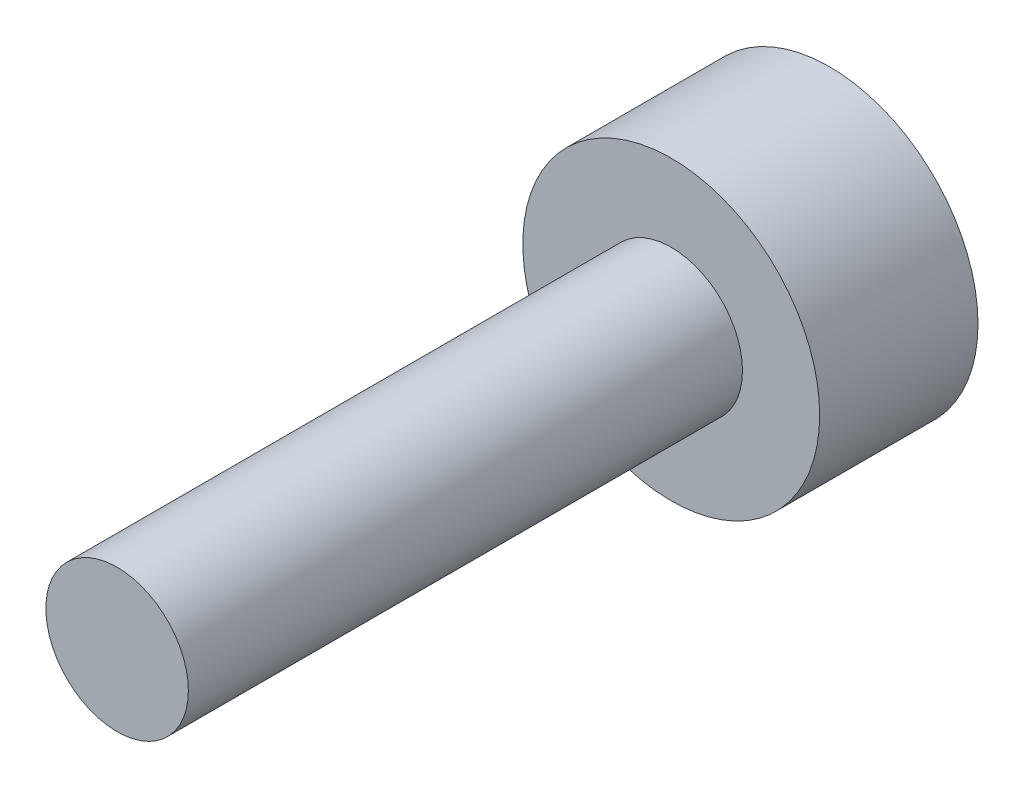
ISO-10303-21;
HEADER;
FILE_DESCRIPTION(('STEP AP214'),'2;1');
FILE_NAME('part.step','',(''),(''),'','','');
FILE_SCHEMA(('AUTOMOTIVE_DESIGN { 1 0 10303 214 1 1 1 1 }'));
ENDSEC;
DATA;
#1=APPLICATION_CONTEXT('core data for automotive mechanical design processes');
#2=APPLICATION_PROTOCOL_DEFINITION('international standard','automotive_design',2000,#1);
#3=PRODUCT_CONTEXT('',#1,'mechanical');
#4=PRODUCT('Part','Part','',(#3));
#5=PRODUCT_RELATED_PRODUCT_CATEGORY('part','',(#4));
#6=PRODUCT_DEFINITION_FORMATION('','',#4);
#7=PRODUCT_DEFINITION_CONTEXT('part definition',#1,'design');
#8=PRODUCT_DEFINITION('design','',#6,#7);
#9=PRODUCT_DEFINITION_SHAPE('','',#8);
#10=(LENGTH_UNIT() NAMED_UNIT(*) SI_UNIT(.MILLI.,.METRE.));
#11=(NAMED_UNIT(*) PLANE_ANGLE_UNIT() SI_UNIT($,.RADIAN.));
#12=(NAMED_UNIT(*) SI_UNIT($,.STERADIAN.) SOLID_ANGLE_UNIT());
#13=UNCERTAINTY_MEASURE_WITH_UNIT(LENGTH_MEASURE(1.E-05),#10,'distance_accuracy_value','');
#14=(GEOMETRIC_REPRESENTATION_CONTEXT(3) GLOBAL_UNCERTAINTY_ASSIGNED_CONTEXT((#13)) GLOBAL_UNIT_ASSIGNED_CONTEXT((#10,
#11,#12)) REPRESENTATION_CONTEXT('',''));
#15=CARTESIAN_POINT('',(0.,0.,0.));
#16=DIRECTION('',(0.,0.,1.));
#17=DIRECTION('',(1.,0.,0.));
#18=AXIS2_PLACEMENT_3D('',#15,#16,#17);
#19=CARTESIAN_POINT('',(0.,0.,14.));
#20=DIRECTION('',(0.,0.,1.));
#21=DIRECTION('',(1.,0.,0.));
#22=AXIS2_PLACEMENT_3D('',#19,#20,#21);
#23=PLANE('',#22);
#24=CARTESIAN_POINT('',(0.,0.,14.));
#25=DIRECTION('',(0.,0.,1.));
#26=DIRECTION('',(1.,0.,0.));
#27=AXIS2_PLACEMENT_3D('',#24,#25,#26);
#28=CIRCLE('',#27,1.8);
#29=CARTESIAN_POINT('',(1.8,0.,14.));
#30=VERTEX_POINT('',#29);
#31=EDGE_CURVE('E25',#30,#30,#28,.T.);
#32=ORIENTED_EDGE('',*,*,#31,.T.);
#33=EDGE_LOOP('',(#32));
#34=FACE_BOUND('',#33,.T.);
#35=ADVANCED_FACE('F17',(#34),#23,.T.);
#36=CARTESIAN_POINT('',(0.,0.,0.));
#37=DIRECTION('',(0.,0.,1.));
#38=DIRECTION('',(1.,0.,0.));
#39=AXIS2_PLACEMENT_3D('',#36,#37,#38);
#40=CYLINDRICAL_SURFACE('',#39,1.8);
#41=ORIENTED_EDGE('',*,*,#31,.F.);
#42=DIRECTION('',(0.,0.,1.));
#43=VECTOR('',#42,1.);
#44=CARTESIAN_POINT('',(1.8,0.,0.));
#45=LINE('',#44,#43);
#46=CARTESIAN_POINT('',(1.8,0.,0.));
#47=VERTEX_POINT('',#46);
#48=EDGE_CURVE('E11',#47,#30,#45,.T.);
#49=ORIENTED_EDGE('',*,*,#48,.F.);
#50=CARTESIAN_POINT('',(0.,0.,0.));
#51=DIRECTION('',(0.,0.,1.));
#52=DIRECTION('',(1.,0.,0.));
#53=AXIS2_PLACEMENT_3D('',#50,#51,#52);
#54=CIRCLE('',#53,1.8);
#55=EDGE_CURVE('E67',#47,#47,#54,.T.);
#56=ORIENTED_EDGE('',*,*,#55,.T.);
#57=ORIENTED_EDGE('',*,*,#48,.T.);
#58=EDGE_LOOP('',(#41,#49,#56,#57));
#59=FACE_BOUND('',#58,.T.);
#60=ADVANCED_FACE('F72',(#59),#40,.T.);
#61=CARTESIAN_POINT('',(0.,0.,-4.));
#62=DIRECTION('',(0.,0.,1.));
#63=DIRECTION('',(1.,0.,0.));
#64=AXIS2_PLACEMENT_3D('',#61,#62,#63);
#65=PLANE('',#64);
#66=CARTESIAN_POINT('',(0.,0.,-4.));
#67=DIRECTION('',(0.,0.,1.));
#68=DIRECTION('',(1.,0.,0.));
#69=AXIS2_PLACEMENT_3D('',#66,#67,#68);
#70=CIRCLE('',#69,3.75);
#71=CARTESIAN_POINT('',(3.75,0.,-4.));
#72=VERTEX_POINT('',#71);
#73=EDGE_CURVE('E56',#72,#72,#70,.T.);
#74=ORIENTED_EDGE('',*,*,#73,.F.);
#75=EDGE_LOOP('',(#74));
#76=FACE_BOUND('',#75,.T.);
#77=ADVANCED_FACE('F74',(#76),#65,.F.);
#78=CARTESIAN_POINT('',(0.,0.,0.));
#79=DIRECTION('',(0.,0.,1.));
#80=DIRECTION('',(1.,0.,0.));
#81=AXIS2_PLACEMENT_3D('',#78,#79,#80);
#82=PLANE('',#81);
#83=ORIENTED_EDGE('',*,*,#55,.F.);
#84=EDGE_LOOP('',(#83));
#85=FACE_BOUND('',#84,.T.);
#86=CARTESIAN_POINT('',(0.,0.,0.));
#87=DIRECTION('',(0.,0.,1.));
#88=DIRECTION('',(1.,0.,0.));
#89=AXIS2_PLACEMENT_3D('',#86,#87,#88);
#90=CIRCLE('',#89,3.75);
#91=CARTESIAN_POINT('',(3.75,0.,0.));
#92=VERTEX_POINT('',#91);
#93=EDGE_CURVE('E54',#92,#92,#90,.T.);
#94=ORIENTED_EDGE('',*,*,#93,.T.);
#95=EDGE_LOOP('',(#94));
#96=FACE_BOUND('',#95,.T.);
#97=ADVANCED_FACE('F60',(#85,#96),#82,.T.);
#98=CARTESIAN_POINT('',(0.,0.,-4.));
#99=DIRECTION('',(0.,0.,1.));
#100=DIRECTION('',(1.,0.,0.));
#101=AXIS2_PLACEMENT_3D('',#98,#99,#100);
#102=CYLINDRICAL_SURFACE('',#101,3.75);
#103=ORIENTED_EDGE('',*,*,#93,.F.);
#104=DIRECTION('',(0.,0.,1.));
#105=VECTOR('',#104,1.);
#106=CARTESIAN_POINT('',(3.75,0.,-4.));
#107=LINE('',#106,#105);
#108=EDGE_CURVE('E51',#72,#92,#107,.T.);
#109=ORIENTED_EDGE('',*,*,#108,.F.);
#110=ORIENTED_EDGE('',*,*,#73,.T.);
#111=ORIENTED_EDGE('',*,*,#108,.T.);
#112=EDGE_LOOP('',(#103,#109,#110,#111));
#113=FACE_BOUND('',#112,.T.);
#114=ADVANCED_FACE('F53',(#113),#102,.T.);
#115=CLOSED_SHELL('',(#35,#60,#77,#97,#114));
#116=MANIFOLD_SOLID_BREP('B1',#115);
#117=ADVANCED_BREP_SHAPE_REPRESENTATION('',(#18,#116),#14);
#118=SHAPE_DEFINITION_REPRESENTATION(#9,#117);
ENDSEC;
END-ISO-10303-21;
